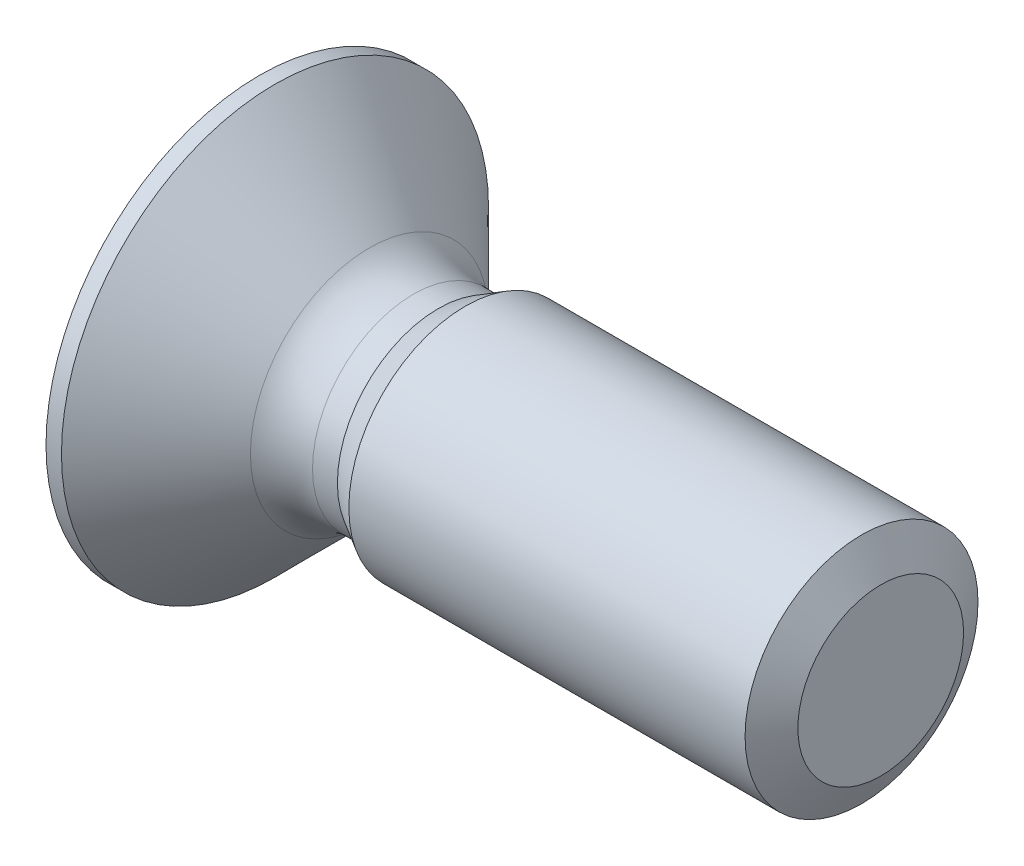
ISO-10303-21;
HEADER;
FILE_DESCRIPTION(('STEP AP214'),'2;1');
FILE_NAME('part.step','',(''),(''),'','','');
FILE_SCHEMA(('AUTOMOTIVE_DESIGN { 1 0 10303 214 1 1 1 1 }'));
ENDSEC;
DATA;
#1=APPLICATION_CONTEXT('core data for automotive mechanical design processes');
#2=APPLICATION_PROTOCOL_DEFINITION('international standard','automotive_design',2000,#1);
#3=PRODUCT_CONTEXT('',#1,'mechanical');
#4=PRODUCT('Part','Part','',(#3));
#5=PRODUCT_RELATED_PRODUCT_CATEGORY('part','',(#4));
#6=PRODUCT_DEFINITION_FORMATION('','',#4);
#7=PRODUCT_DEFINITION_CONTEXT('part definition',#1,'design');
#8=PRODUCT_DEFINITION('design','',#6,#7);
#9=PRODUCT_DEFINITION_SHAPE('','',#8);
#10=(LENGTH_UNIT() NAMED_UNIT(*) SI_UNIT(.MILLI.,.METRE.));
#11=(NAMED_UNIT(*) PLANE_ANGLE_UNIT() SI_UNIT($,.RADIAN.));
#12=(NAMED_UNIT(*) SI_UNIT($,.STERADIAN.) SOLID_ANGLE_UNIT());
#13=UNCERTAINTY_MEASURE_WITH_UNIT(LENGTH_MEASURE(1.E-05),#10,'distance_accuracy_value','');
#14=(GEOMETRIC_REPRESENTATION_CONTEXT(3) GLOBAL_UNCERTAINTY_ASSIGNED_CONTEXT((#13)) GLOBAL_UNIT_ASSIGNED_CONTEXT((#10,
#11,#12)) REPRESENTATION_CONTEXT('',''));
#15=CARTESIAN_POINT('',(0.,0.,0.));
#16=DIRECTION('',(0.,0.,1.));
#17=DIRECTION('',(1.,0.,0.));
#18=AXIS2_PLACEMENT_3D('',#15,#16,#17);
#19=CARTESIAN_POINT('',(0.,0.,0.));
#20=DIRECTION('',(1.,0.,0.));
#21=DIRECTION('',(0.,0.,-1.));
#22=AXIS2_PLACEMENT_3D('',#19,#20,#21);
#23=PLANE('',#22);
#24=CARTESIAN_POINT('',(0.,0.,0.));
#25=DIRECTION('',(-1.,0.,0.));
#26=DIRECTION('',(0.,0.,1.));
#27=AXIS2_PLACEMENT_3D('',#24,#25,#26);
#28=CIRCLE('',#27,2.75);
#29=CARTESIAN_POINT('',(0.,0.,2.75));
#30=VERTEX_POINT('',#29);
#31=EDGE_CURVE('E182',#30,#30,#28,.T.);
#32=ORIENTED_EDGE('',*,*,#31,.T.);
#33=EDGE_LOOP('',(#32));
#34=FACE_BOUND('',#33,.T.);
#35=DIRECTION('',(0.,1.,0.));
#36=VECTOR('',#35,1.);
#37=CARTESIAN_POINT('',(0.,1.6,0.250000000000006));
#38=LINE('',#37,#36);
#39=CARTESIAN_POINT('',(0.,0.25,0.250000000000001));
#40=VERTEX_POINT('',#39);
#41=CARTESIAN_POINT('',(0.,1.6,0.250000000000006));
#42=VERTEX_POINT('',#41);
#43=EDGE_CURVE('E104',#40,#42,#38,.T.);
#44=ORIENTED_EDGE('',*,*,#43,.F.);
#45=DIRECTION('',(0.,0.,-1.));
#46=VECTOR('',#45,1.);
#47=CARTESIAN_POINT('',(0.,0.25,-1.6));
#48=LINE('',#47,#46);
#49=CARTESIAN_POINT('',(0.,0.25,1.6));
#50=VERTEX_POINT('',#49);
#51=EDGE_CURVE('E149',#50,#40,#48,.T.);
#52=ORIENTED_EDGE('',*,*,#51,.F.);
#53=DIRECTION('',(0.,1.,0.));
#54=VECTOR('',#53,1.);
#55=CARTESIAN_POINT('',(0.,0.25,1.6));
#56=LINE('',#55,#54);
#57=CARTESIAN_POINT('',(0.,-0.25,1.6));
#58=VERTEX_POINT('',#57);
#59=EDGE_CURVE('E146',#58,#50,#56,.T.);
#60=ORIENTED_EDGE('',*,*,#59,.F.);
#61=DIRECTION('',(0.,0.,1.));
#62=VECTOR('',#61,1.);
#63=CARTESIAN_POINT('',(0.,-0.25,-1.6));
#64=LINE('',#63,#62);
#65=CARTESIAN_POINT('',(0.,-0.25,0.249999999999999));
#66=VERTEX_POINT('',#65);
#67=EDGE_CURVE('E77',#66,#58,#64,.T.);
#68=ORIENTED_EDGE('',*,*,#67,.F.);
#69=CARTESIAN_POINT('',(0.,-1.6,0.249999999999994));
#70=VERTEX_POINT('',#69);
#71=EDGE_CURVE('E112',#70,#66,#38,.T.);
#72=ORIENTED_EDGE('',*,*,#71,.F.);
#73=DIRECTION('',(0.,0.,1.));
#74=VECTOR('',#73,1.);
#75=CARTESIAN_POINT('',(0.,-1.6,0.249999999999994));
#76=LINE('',#75,#74);
#77=CARTESIAN_POINT('',(0.,-1.6,-0.250000000000006));
#78=VERTEX_POINT('',#77);
#79=EDGE_CURVE('E113',#78,#70,#76,.T.);
#80=ORIENTED_EDGE('',*,*,#79,.F.);
#81=DIRECTION('',(0.,-1.,0.));
#82=VECTOR('',#81,1.);
#83=CARTESIAN_POINT('',(0.,1.6,-0.249999999999994));
#84=LINE('',#83,#82);
#85=CARTESIAN_POINT('',(0.,-0.25,-0.250000000000001));
#86=VERTEX_POINT('',#85);
#87=EDGE_CURVE('E126',#86,#78,#84,.T.);
#88=ORIENTED_EDGE('',*,*,#87,.F.);
#89=CARTESIAN_POINT('',(0.,-0.25,-1.6));
#90=VERTEX_POINT('',#89);
#91=EDGE_CURVE('E143',#90,#86,#64,.T.);
#92=ORIENTED_EDGE('',*,*,#91,.F.);
#93=DIRECTION('',(0.,-1.,0.));
#94=VECTOR('',#93,1.);
#95=CARTESIAN_POINT('',(0.,0.25,-1.6));
#96=LINE('',#95,#94);
#97=CARTESIAN_POINT('',(0.,0.25,-1.6));
#98=VERTEX_POINT('',#97);
#99=EDGE_CURVE('E54',#98,#90,#96,.T.);
#100=ORIENTED_EDGE('',*,*,#99,.F.);
#101=CARTESIAN_POINT('',(0.,0.25,-0.249999999999999));
#102=VERTEX_POINT('',#101);
#103=EDGE_CURVE('E152',#102,#98,#48,.T.);
#104=ORIENTED_EDGE('',*,*,#103,.F.);
#105=CARTESIAN_POINT('',(0.,1.6,-0.249999999999994));
#106=VERTEX_POINT('',#105);
#107=EDGE_CURVE('E125',#106,#102,#84,.T.);
#108=ORIENTED_EDGE('',*,*,#107,.F.);
#109=DIRECTION('',(0.,0.,-1.));
#110=VECTOR('',#109,1.);
#111=CARTESIAN_POINT('',(0.,1.6,0.250000000000006));
#112=LINE('',#111,#110);
#113=EDGE_CURVE('E118',#42,#106,#112,.T.);
#114=ORIENTED_EDGE('',*,*,#113,.F.);
#115=EDGE_LOOP('',(#44,#52,#60,#68,#72,#80,#88,#92,#100,#104,#108,#114));
#116=FACE_BOUND('',#115,.T.);
#117=ADVANCED_FACE('F40',(#34,#116),#23,.F.);
#118=CARTESIAN_POINT('',(2.1,0.,0.));
#119=DIRECTION('',(-0.118212889785112,-0.992988274194944,0.));
#120=DIRECTION('',(0.992988274194944,-0.118212889785112,0.));
#121=AXIS2_PLACEMENT_3D('',#118,#119,#120);
#122=PLANE('',#121);
#123=ORIENTED_EDGE('',*,*,#51,.T.);
#124=DIRECTION('',(0.986122002690152,-0.117395476510732,-0.117395476510733));
#125=VECTOR('',#124,1.);
#126=CARTESIAN_POINT('',(2.1,0.,0.));
#127=LINE('',#126,#125);
#128=CARTESIAN_POINT('',(2.1,0.,0.));
#129=VERTEX_POINT('',#128);
#130=EDGE_CURVE('E83',#40,#129,#127,.T.);
#131=ORIENTED_EDGE('',*,*,#130,.T.);
#132=DIRECTION('',(0.791889207905293,-0.0942725247506301,-0.603344158404032));
#133=VECTOR('',#132,1.);
#134=CARTESIAN_POINT('',(0.,0.25,1.6));
#135=LINE('',#134,#133);
#136=EDGE_CURVE('E63',#50,#129,#135,.T.);
#137=ORIENTED_EDGE('',*,*,#136,.F.);
#138=EDGE_LOOP('',(#123,#131,#137));
#139=FACE_BOUND('',#138,.T.);
#140=ADVANCED_FACE('F198',(#139),#122,.T.);
#141=DIRECTION('',(0.791889207905293,-0.0942725247506301,0.603344158404032));
#142=VECTOR('',#141,1.);
#143=CARTESIAN_POINT('',(0.,0.25,-1.6));
#144=LINE('',#143,#142);
#145=EDGE_CURVE('E148',#98,#129,#144,.T.);
#146=ORIENTED_EDGE('',*,*,#145,.T.);
#147=DIRECTION('',(-0.986122002690152,0.117395476510732,-0.117395476510732));
#148=VECTOR('',#147,1.);
#149=CARTESIAN_POINT('',(2.1,0.,0.));
#150=LINE('',#149,#148);
#151=EDGE_CURVE('E130',#129,#102,#150,.T.);
#152=ORIENTED_EDGE('',*,*,#151,.T.);
#153=ORIENTED_EDGE('',*,*,#103,.T.);
#154=EDGE_LOOP('',(#146,#152,#153));
#155=FACE_BOUND('',#154,.T.);
#156=ADVANCED_FACE('F192',(#155),#122,.T.);
#157=CARTESIAN_POINT('',(2.1,0.,0.));
#158=DIRECTION('',(-0.118212889785112,0.992988274194944,0.));
#159=DIRECTION('',(-0.992988274194944,-0.118212889785112,0.));
#160=AXIS2_PLACEMENT_3D('',#157,#158,#159);
#161=PLANE('',#160);
#162=DIRECTION('',(0.791889207905293,0.0942725247506301,-0.603344158404032));
#163=VECTOR('',#162,1.);
#164=CARTESIAN_POINT('',(0.,-0.25,1.6));
#165=LINE('',#164,#163);
#166=EDGE_CURVE('E142',#58,#129,#165,.T.);
#167=ORIENTED_EDGE('',*,*,#166,.T.);
#168=DIRECTION('',(-0.986122002690152,-0.117395476510732,0.117395476510732));
#169=VECTOR('',#168,1.);
#170=CARTESIAN_POINT('',(2.1,0.,0.));
#171=LINE('',#170,#169);
#172=EDGE_CURVE('E11',#129,#66,#171,.T.);
#173=ORIENTED_EDGE('',*,*,#172,.T.);
#174=ORIENTED_EDGE('',*,*,#67,.T.);
#175=EDGE_LOOP('',(#167,#173,#174));
#176=FACE_BOUND('',#175,.T.);
#177=ADVANCED_FACE('F193',(#176),#161,.T.);
#178=ORIENTED_EDGE('',*,*,#91,.T.);
#179=DIRECTION('',(0.986122002690152,0.117395476510732,0.117395476510733));
#180=VECTOR('',#179,1.);
#181=CARTESIAN_POINT('',(2.1,0.,0.));
#182=LINE('',#181,#180);
#183=EDGE_CURVE('E47',#86,#129,#182,.T.);
#184=ORIENTED_EDGE('',*,*,#183,.T.);
#185=DIRECTION('',(0.791889207905293,0.0942725247506301,0.603344158404032));
#186=VECTOR('',#185,1.);
#187=CARTESIAN_POINT('',(0.,-0.25,-1.6));
#188=LINE('',#187,#186);
#189=EDGE_CURVE('E157',#90,#129,#188,.T.);
#190=ORIENTED_EDGE('',*,*,#189,.F.);
#191=EDGE_LOOP('',(#178,#184,#190));
#192=FACE_BOUND('',#191,.T.);
#193=ADVANCED_FACE('F186',(#192),#161,.T.);
#194=CARTESIAN_POINT('',(0.,0.,0.));
#195=DIRECTION('',(-1.,0.,0.));
#196=DIRECTION('',(0.,0.,1.));
#197=AXIS2_PLACEMENT_3D('',#194,#195,#196);
#198=CYLINDRICAL_SURFACE('',#197,2.75);
#199=ORIENTED_EDGE('',*,*,#31,.F.);
#200=EDGE_LOOP('',(#199));
#201=FACE_BOUND('',#200,.T.);
#202=CARTESIAN_POINT('',(0.199000000000005,0.,0.));
#203=DIRECTION('',(-1.,0.,0.));
#204=DIRECTION('',(0.,0.,1.));
#205=AXIS2_PLACEMENT_3D('',#202,#203,#204);
#206=CIRCLE('',#205,2.75);
#207=CARTESIAN_POINT('',(0.199000000000005,0.,2.75));
#208=VERTEX_POINT('',#207);
#209=EDGE_CURVE('E178',#208,#208,#206,.T.);
#210=ORIENTED_EDGE('',*,*,#209,.T.);
#211=EDGE_LOOP('',(#210));
#212=FACE_BOUND('',#211,.T.);
#213=ADVANCED_FACE('F226',(#201,#212),#198,.T.);
#214=CARTESIAN_POINT('',(1.41568542494924,0.,0.));
#215=DIRECTION('',(-1.,0.,0.));
#216=DIRECTION('',(0.,0.,1.));
#217=AXIS2_PLACEMENT_3D('',#214,#215,#216);
#218=CONICAL_SURFACE('',#217,1.53331457505076,0.78539816339745);
#219=ORIENTED_EDGE('',*,*,#209,.F.);
#220=EDGE_LOOP('',(#219));
#221=FACE_BOUND('',#220,.T.);
#222=CARTESIAN_POINT('',(1.41568542494924,0.,0.));
#223=DIRECTION('',(-1.,0.,0.));
#224=DIRECTION('',(0.,0.,1.));
#225=AXIS2_PLACEMENT_3D('',#222,#223,#224);
#226=CIRCLE('',#225,1.53331457505076);
#227=CARTESIAN_POINT('',(1.41568542494924,0.,1.53331457505076));
#228=VERTEX_POINT('',#227);
#229=EDGE_CURVE('E174',#228,#228,#226,.T.);
#230=ORIENTED_EDGE('',*,*,#229,.T.);
#231=EDGE_LOOP('',(#230));
#232=FACE_BOUND('',#231,.T.);
#233=ADVANCED_FACE('F229',(#221,#232),#218,.T.);
#234=CARTESIAN_POINT('',(1.98137084989848,0.,0.));
#235=DIRECTION('',(-1.,0.,0.));
#236=DIRECTION('',(0.,0.,1.));
#237=AXIS2_PLACEMENT_3D('',#234,#235,#236);
#238=TOROIDAL_SURFACE('',#237,2.099,0.8);
#239=ORIENTED_EDGE('',*,*,#229,.F.);
#240=EDGE_LOOP('',(#239));
#241=FACE_BOUND('',#240,.T.);
#242=CARTESIAN_POINT('',(1.98137084989848,0.,0.));
#243=DIRECTION('',(-1.,0.,0.));
#244=DIRECTION('',(0.,0.,1.));
#245=AXIS2_PLACEMENT_3D('',#242,#243,#244);
#246=CIRCLE('',#245,1.299);
#247=CARTESIAN_POINT('',(1.98137084989848,0.,1.299));
#248=VERTEX_POINT('',#247);
#249=EDGE_CURVE('E171',#248,#248,#246,.T.);
#250=ORIENTED_EDGE('',*,*,#249,.T.);
#251=EDGE_LOOP('',(#250));
#252=FACE_BOUND('',#251,.T.);
#253=ADVANCED_FACE('F234',(#241,#252),#238,.F.);
#254=CARTESIAN_POINT('',(0.,0.,0.));
#255=DIRECTION('',(-1.,0.,0.));
#256=DIRECTION('',(0.,0.,1.));
#257=AXIS2_PLACEMENT_3D('',#254,#255,#256);
#258=CYLINDRICAL_SURFACE('',#257,1.299);
#259=ORIENTED_EDGE('',*,*,#249,.F.);
#260=EDGE_LOOP('',(#259));
#261=FACE_BOUND('',#260,.T.);
#262=CARTESIAN_POINT('',(2.30185778767866,0.,0.));
#263=DIRECTION('',(-1.,0.,0.));
#264=DIRECTION('',(0.,0.,1.));
#265=AXIS2_PLACEMENT_3D('',#262,#263,#264);
#266=CIRCLE('',#265,1.299);
#267=CARTESIAN_POINT('',(2.30185778767866,0.,1.299));
#268=VERTEX_POINT('',#267);
#269=EDGE_CURVE('E168',#268,#268,#266,.T.);
#270=ORIENTED_EDGE('',*,*,#269,.T.);
#271=EDGE_LOOP('',(#270));
#272=FACE_BOUND('',#271,.T.);
#273=ADVANCED_FACE('F240',(#261,#272),#258,.T.);
#274=CARTESIAN_POINT('',(2.65,0.,0.));
#275=DIRECTION('',(1.,0.,0.));
#276=DIRECTION('',(0.,0.,-1.));
#277=AXIS2_PLACEMENT_3D('',#274,#275,#276);
#278=CONICAL_SURFACE('',#277,1.5,0.5235987755983);
#279=ORIENTED_EDGE('',*,*,#269,.F.);
#280=EDGE_LOOP('',(#279));
#281=FACE_BOUND('',#280,.T.);
#282=CARTESIAN_POINT('',(2.65,0.,0.));
#283=DIRECTION('',(-1.,0.,0.));
#284=DIRECTION('',(0.,0.,1.));
#285=AXIS2_PLACEMENT_3D('',#282,#283,#284);
#286=CIRCLE('',#285,1.5);
#287=CARTESIAN_POINT('',(2.65,0.,1.5));
#288=VERTEX_POINT('',#287);
#289=EDGE_CURVE('E165',#288,#288,#286,.T.);
#290=ORIENTED_EDGE('',*,*,#289,.T.);
#291=EDGE_LOOP('',(#290));
#292=FACE_BOUND('',#291,.T.);
#293=ADVANCED_FACE('F246',(#281,#292),#278,.T.);
#294=CARTESIAN_POINT('',(0.,0.,0.));
#295=DIRECTION('',(-1.,0.,0.));
#296=DIRECTION('',(0.,0.,1.));
#297=AXIS2_PLACEMENT_3D('',#294,#295,#296);
#298=CYLINDRICAL_SURFACE('',#297,1.5);
#299=CARTESIAN_POINT('',(7.75270800287124,0.,0.));
#300=DIRECTION('',(1.,0.,0.));
#301=DIRECTION('',(0.,0.,-1.));
#302=AXIS2_PLACEMENT_3D('',#299,#300,#301);
#303=CIRCLE('',#302,1.5);
#304=CARTESIAN_POINT('',(7.75270800287124,0.,-1.5));
#305=VERTEX_POINT('',#304);
#306=EDGE_CURVE('E162',#305,#305,#303,.T.);
#307=ORIENTED_EDGE('',*,*,#306,.F.);
#308=EDGE_LOOP('',(#307));
#309=FACE_BOUND('',#308,.T.);
#310=ORIENTED_EDGE('',*,*,#289,.F.);
#311=EDGE_LOOP('',(#310));
#312=FACE_BOUND('',#311,.T.);
#313=ADVANCED_FACE('F252',(#309,#312),#298,.T.);
#314=CARTESIAN_POINT('',(7.75270800287124,0.,0.));
#315=DIRECTION('',(-1.,0.,0.));
#316=DIRECTION('',(0.,0.,1.));
#317=AXIS2_PLACEMENT_3D('',#314,#315,#316);
#318=CONICAL_SURFACE('',#317,1.5,1.05188801855135);
#319=CARTESIAN_POINT('',(8.,0.,0.));
#320=DIRECTION('',(1.,0.,0.));
#321=DIRECTION('',(0.,0.,-1.));
#322=AXIS2_PLACEMENT_3D('',#319,#320,#321);
#323=CIRCLE('',#322,1.067);
#324=CARTESIAN_POINT('',(8.,0.,-1.067));
#325=VERTEX_POINT('',#324);
#326=EDGE_CURVE('E151',#325,#325,#323,.T.);
#327=ORIENTED_EDGE('',*,*,#326,.F.);
#328=EDGE_LOOP('',(#327));
#329=FACE_BOUND('',#328,.T.);
#330=ORIENTED_EDGE('',*,*,#306,.T.);
#331=EDGE_LOOP('',(#330));
#332=FACE_BOUND('',#331,.T.);
#333=ADVANCED_FACE('F257',(#329,#332),#318,.T.);
#334=CARTESIAN_POINT('',(8.,1.5,0.));
#335=DIRECTION('',(-1.,0.,0.));
#336=DIRECTION('',(0.,0.,1.));
#337=AXIS2_PLACEMENT_3D('',#334,#335,#336);
#338=PLANE('',#337);
#339=ORIENTED_EDGE('',*,*,#326,.T.);
#340=EDGE_LOOP('',(#339));
#341=FACE_BOUND('',#340,.T.);
#342=ADVANCED_FACE('F263',(#341),#338,.F.);
#343=CARTESIAN_POINT('',(0.,0.25,-1.6));
#344=DIRECTION('',(0.606043215262856,0.,-0.795431720032499));
#345=DIRECTION('',(-0.795431720032499,0.,-0.606043215262856));
#346=AXIS2_PLACEMENT_3D('',#343,#344,#345);
#347=PLANE('',#346);
#348=ORIENTED_EDGE('',*,*,#145,.F.);
#349=ORIENTED_EDGE('',*,*,#99,.T.);
#350=ORIENTED_EDGE('',*,*,#189,.T.);
#351=EDGE_LOOP('',(#348,#349,#350));
#352=FACE_BOUND('',#351,.T.);
#353=ADVANCED_FACE('F190',(#352),#347,.F.);
#354=CARTESIAN_POINT('',(0.,-0.25,1.6));
#355=DIRECTION('',(0.606043215262856,0.,0.795431720032499));
#356=DIRECTION('',(0.795431720032499,0.,-0.606043215262856));
#357=AXIS2_PLACEMENT_3D('',#354,#355,#356);
#358=PLANE('',#357);
#359=ORIENTED_EDGE('',*,*,#166,.F.);
#360=ORIENTED_EDGE('',*,*,#59,.T.);
#361=ORIENTED_EDGE('',*,*,#136,.T.);
#362=EDGE_LOOP('',(#359,#360,#361));
#363=FACE_BOUND('',#362,.T.);
#364=ADVANCED_FACE('F197',(#363),#358,.F.);
#365=CARTESIAN_POINT('',(2.1,0.,0.));
#366=DIRECTION('',(-0.118212889785112,0.,-0.992988274194944));
#367=DIRECTION('',(0.992988274194944,0.,-0.118212889785112));
#368=AXIS2_PLACEMENT_3D('',#365,#366,#367);
#369=PLANE('',#368);
#370=DIRECTION('',(0.791889207905293,0.603344158404033,-0.0942725247506279));
#371=VECTOR('',#370,1.);
#372=CARTESIAN_POINT('',(0.,-1.6,0.249999999999994));
#373=LINE('',#372,#371);
#374=EDGE_CURVE('E122',#70,#129,#373,.T.);
#375=ORIENTED_EDGE('',*,*,#374,.F.);
#376=ORIENTED_EDGE('',*,*,#71,.T.);
#377=ORIENTED_EDGE('',*,*,#172,.F.);
#378=EDGE_LOOP('',(#375,#376,#377));
#379=FACE_BOUND('',#378,.T.);
#380=ADVANCED_FACE('F202',(#379),#369,.T.);
#381=CARTESIAN_POINT('',(2.1,0.,0.));
#382=DIRECTION('',(-0.118212889785112,0.,0.992988274194944));
#383=DIRECTION('',(-0.992988274194944,0.,-0.118212889785112));
#384=AXIS2_PLACEMENT_3D('',#381,#382,#383);
#385=PLANE('',#384);
#386=ORIENTED_EDGE('',*,*,#87,.T.);
#387=DIRECTION('',(0.791889207905293,0.603344158404032,0.0942725247506322));
#388=VECTOR('',#387,1.);
#389=CARTESIAN_POINT('',(0.,-1.6,-0.250000000000006));
#390=LINE('',#389,#388);
#391=EDGE_CURVE('E136',#78,#129,#390,.T.);
#392=ORIENTED_EDGE('',*,*,#391,.T.);
#393=ORIENTED_EDGE('',*,*,#183,.F.);
#394=EDGE_LOOP('',(#386,#392,#393));
#395=FACE_BOUND('',#394,.T.);
#396=ADVANCED_FACE('F206',(#395),#385,.T.);
#397=CARTESIAN_POINT('',(0.,-1.6,-0.250000000000006));
#398=DIRECTION('',(0.606043215262856,-0.795431720032499,0.));
#399=DIRECTION('',(0.795431720032499,0.606043215262856,0.));
#400=AXIS2_PLACEMENT_3D('',#397,#398,#399);
#401=PLANE('',#400);
#402=ORIENTED_EDGE('',*,*,#391,.F.);
#403=ORIENTED_EDGE('',*,*,#79,.T.);
#404=ORIENTED_EDGE('',*,*,#374,.T.);
#405=EDGE_LOOP('',(#402,#403,#404));
#406=FACE_BOUND('',#405,.T.);
#407=ADVANCED_FACE('F205',(#406),#401,.F.);
#408=ORIENTED_EDGE('',*,*,#43,.T.);
#409=DIRECTION('',(0.791889207905293,-0.603344158404032,-0.0942725247506322));
#410=VECTOR('',#409,1.);
#411=CARTESIAN_POINT('',(0.,1.6,0.250000000000006));
#412=LINE('',#411,#410);
#413=EDGE_CURVE('E107',#42,#129,#412,.T.);
#414=ORIENTED_EDGE('',*,*,#413,.T.);
#415=ORIENTED_EDGE('',*,*,#130,.F.);
#416=EDGE_LOOP('',(#408,#414,#415));
#417=FACE_BOUND('',#416,.T.);
#418=ADVANCED_FACE('F106',(#417),#369,.T.);
#419=DIRECTION('',(0.791889207905293,-0.603344158404033,0.0942725247506279));
#420=VECTOR('',#419,1.);
#421=CARTESIAN_POINT('',(0.,1.6,-0.249999999999994));
#422=LINE('',#421,#420);
#423=EDGE_CURVE('E120',#106,#129,#422,.T.);
#424=ORIENTED_EDGE('',*,*,#423,.F.);
#425=ORIENTED_EDGE('',*,*,#107,.T.);
#426=ORIENTED_EDGE('',*,*,#151,.F.);
#427=EDGE_LOOP('',(#424,#425,#426));
#428=FACE_BOUND('',#427,.T.);
#429=ADVANCED_FACE('F209',(#428),#385,.T.);
#430=CARTESIAN_POINT('',(0.,1.6,0.250000000000006));
#431=DIRECTION('',(0.606043215262856,0.795431720032499,0.));
#432=DIRECTION('',(-0.795431720032499,0.606043215262856,0.));
#433=AXIS2_PLACEMENT_3D('',#430,#431,#432);
#434=PLANE('',#433);
#435=ORIENTED_EDGE('',*,*,#413,.F.);
#436=ORIENTED_EDGE('',*,*,#113,.T.);
#437=ORIENTED_EDGE('',*,*,#423,.T.);
#438=EDGE_LOOP('',(#435,#436,#437));
#439=FACE_BOUND('',#438,.T.);
#440=ADVANCED_FACE('F117',(#439),#434,.F.);
#441=CLOSED_SHELL('',(#117,#140,#156,#177,#193,#213,#233,#253,#273,#293,#313,#333,#342,#353,
#364,#380,#396,#407,#418,#429,#440));
#442=MANIFOLD_SOLID_BREP('B2',#441);
#443=ADVANCED_BREP_SHAPE_REPRESENTATION('',(#18,#442),#14);
#444=SHAPE_DEFINITION_REPRESENTATION(#9,#443);
ENDSEC;
END-ISO-10303-21;
